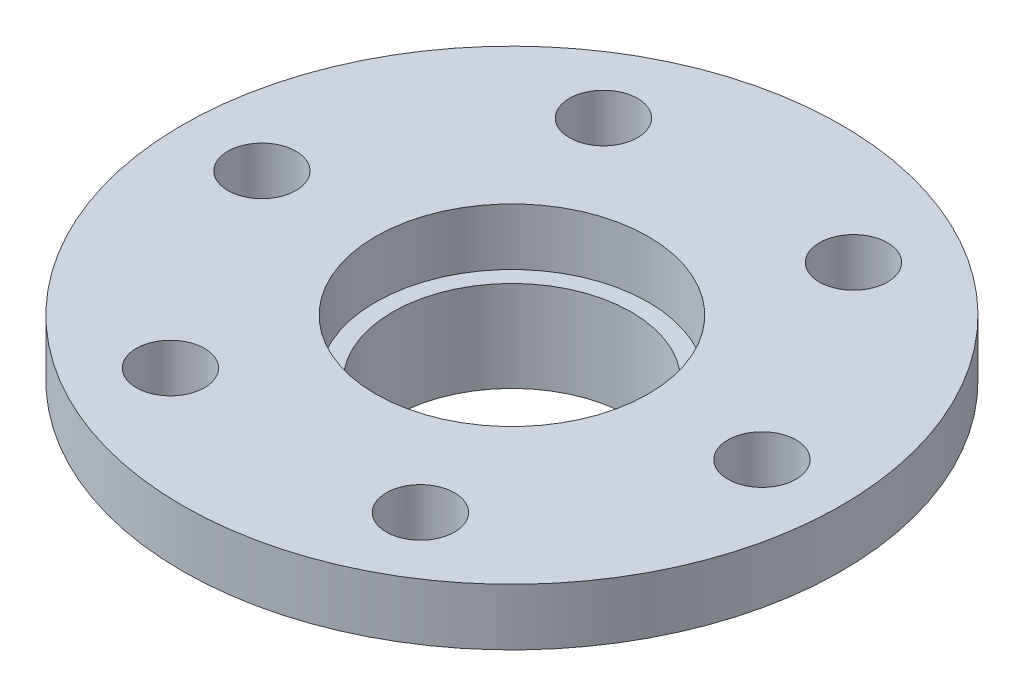
ISO-10303-21;
HEADER;
FILE_DESCRIPTION(('STEP AP214'),'2;1');
FILE_NAME('part.step','',(''),(''),'','','');
FILE_SCHEMA(('AUTOMOTIVE_DESIGN { 1 0 10303 214 1 1 1 1 }'));
ENDSEC;
DATA;
#1=APPLICATION_CONTEXT('core data for automotive mechanical design processes');
#2=APPLICATION_PROTOCOL_DEFINITION('international standard','automotive_design',2000,#1);
#3=PRODUCT_CONTEXT('',#1,'mechanical');
#4=PRODUCT('Part','Part','',(#3));
#5=PRODUCT_RELATED_PRODUCT_CATEGORY('part','',(#4));
#6=PRODUCT_DEFINITION_FORMATION('','',#4);
#7=PRODUCT_DEFINITION_CONTEXT('part definition',#1,'design');
#8=PRODUCT_DEFINITION('design','',#6,#7);
#9=PRODUCT_DEFINITION_SHAPE('','',#8);
#10=(LENGTH_UNIT() NAMED_UNIT(*) SI_UNIT(.MILLI.,.METRE.));
#11=(NAMED_UNIT(*) PLANE_ANGLE_UNIT() SI_UNIT($,.RADIAN.));
#12=(NAMED_UNIT(*) SI_UNIT($,.STERADIAN.) SOLID_ANGLE_UNIT());
#13=UNCERTAINTY_MEASURE_WITH_UNIT(LENGTH_MEASURE(1.E-05),#10,'distance_accuracy_value','');
#14=(GEOMETRIC_REPRESENTATION_CONTEXT(3) GLOBAL_UNCERTAINTY_ASSIGNED_CONTEXT((#13)) GLOBAL_UNIT_ASSIGNED_CONTEXT((#10,
#11,#12)) REPRESENTATION_CONTEXT('',''));
#15=CARTESIAN_POINT('',(0.,0.,0.));
#16=DIRECTION('',(0.,0.,1.));
#17=DIRECTION('',(1.,0.,0.));
#18=AXIS2_PLACEMENT_3D('',#15,#16,#17);
#19=CARTESIAN_POINT('',(0.,8.,0.));
#20=DIRECTION('',(0.,1.,0.));
#21=DIRECTION('',(0.,0.,1.));
#22=AXIS2_PLACEMENT_3D('',#19,#20,#21);
#23=PLANE('',#22);
#24=CARTESIAN_POINT('',(0.,8.,0.));
#25=DIRECTION('',(0.,1.,0.));
#26=DIRECTION('',(0.,0.,1.));
#27=AXIS2_PLACEMENT_3D('',#24,#25,#26);
#28=CIRCLE('',#27,29.);
#29=CARTESIAN_POINT('',(0.,8.,29.));
#30=VERTEX_POINT('',#29);
#31=EDGE_CURVE('E47',#30,#30,#28,.T.);
#32=ORIENTED_EDGE('',*,*,#31,.F.);
#33=EDGE_LOOP('',(#32));
#34=FACE_BOUND('',#33,.T.);
#35=CARTESIAN_POINT('',(11.,8.,-19.0525588832576));
#36=DIRECTION('',(0.,-1.,0.));
#37=DIRECTION('',(0.,0.,-1.));
#38=AXIS2_PLACEMENT_3D('',#35,#36,#37);
#39=CIRCLE('',#38,3.);
#40=CARTESIAN_POINT('',(11.,8.,-22.0525588832576));
#41=VERTEX_POINT('',#40);
#42=EDGE_CURVE('E87',#41,#41,#39,.T.);
#43=ORIENTED_EDGE('',*,*,#42,.F.);
#44=EDGE_LOOP('',(#43));
#45=FACE_BOUND('',#44,.T.);
#46=CARTESIAN_POINT('',(-11.,8.,-19.0525588832577));
#47=DIRECTION('',(0.,-1.,0.));
#48=DIRECTION('',(0.,0.,-1.));
#49=AXIS2_PLACEMENT_3D('',#46,#47,#48);
#50=CIRCLE('',#49,3.);
#51=CARTESIAN_POINT('',(-11.,8.,-22.0525588832577));
#52=VERTEX_POINT('',#51);
#53=EDGE_CURVE('E81',#52,#52,#50,.T.);
#54=ORIENTED_EDGE('',*,*,#53,.F.);
#55=EDGE_LOOP('',(#54));
#56=FACE_BOUND('',#55,.T.);
#57=CARTESIAN_POINT('',(-22.,8.,0.));
#58=DIRECTION('',(0.,-1.,0.));
#59=DIRECTION('',(0.,0.,-1.));
#60=AXIS2_PLACEMENT_3D('',#57,#58,#59);
#61=CIRCLE('',#60,3.);
#62=CARTESIAN_POINT('',(-22.,8.,-3.));
#63=VERTEX_POINT('',#62);
#64=EDGE_CURVE('E75',#63,#63,#61,.T.);
#65=ORIENTED_EDGE('',*,*,#64,.F.);
#66=EDGE_LOOP('',(#65));
#67=FACE_BOUND('',#66,.T.);
#68=CARTESIAN_POINT('',(-11.,8.,19.0525588832576));
#69=DIRECTION('',(0.,-1.,0.));
#70=DIRECTION('',(0.,0.,-1.));
#71=AXIS2_PLACEMENT_3D('',#68,#69,#70);
#72=CIRCLE('',#71,3.);
#73=CARTESIAN_POINT('',(-11.,8.,16.0525588832576));
#74=VERTEX_POINT('',#73);
#75=EDGE_CURVE('E68',#74,#74,#72,.T.);
#76=ORIENTED_EDGE('',*,*,#75,.F.);
#77=EDGE_LOOP('',(#76));
#78=FACE_BOUND('',#77,.T.);
#79=CARTESIAN_POINT('',(11.,8.,19.0525588832577));
#80=DIRECTION('',(0.,-1.,0.));
#81=DIRECTION('',(0.,0.,-1.));
#82=AXIS2_PLACEMENT_3D('',#79,#80,#81);
#83=CIRCLE('',#82,3.);
#84=CARTESIAN_POINT('',(11.,8.,16.0525588832577));
#85=VERTEX_POINT('',#84);
#86=EDGE_CURVE('E69',#85,#85,#83,.T.);
#87=ORIENTED_EDGE('',*,*,#86,.F.);
#88=EDGE_LOOP('',(#87));
#89=FACE_BOUND('',#88,.T.);
#90=CARTESIAN_POINT('',(22.,8.,0.));
#91=DIRECTION('',(0.,-1.,0.));
#92=DIRECTION('',(0.,0.,-1.));
#93=AXIS2_PLACEMENT_3D('',#90,#91,#92);
#94=CIRCLE('',#93,2.99999999999999);
#95=CARTESIAN_POINT('',(22.,8.,-2.99999999999999));
#96=VERTEX_POINT('',#95);
#97=EDGE_CURVE('E62',#96,#96,#94,.T.);
#98=ORIENTED_EDGE('',*,*,#97,.F.);
#99=EDGE_LOOP('',(#98));
#100=FACE_BOUND('',#99,.T.);
#101=CARTESIAN_POINT('',(0.,8.,0.));
#102=DIRECTION('',(0.,1.,0.));
#103=DIRECTION('',(0.,0.,1.));
#104=AXIS2_PLACEMENT_3D('',#101,#102,#103);
#105=CIRCLE('',#104,18.8);
#106=CARTESIAN_POINT('',(0.,8.,18.8));
#107=VERTEX_POINT('',#106);
#108=EDGE_CURVE('E10',#107,#107,#105,.F.);
#109=ORIENTED_EDGE('',*,*,#108,.F.);
#110=EDGE_LOOP('',(#109));
#111=FACE_BOUND('',#110,.T.);
#112=ADVANCED_FACE('F32',(#34,#45,#56,#67,#78,#89,#100,#111),#23,.F.);
#113=CARTESIAN_POINT('',(0.,8.,0.));
#114=DIRECTION('',(0.,-1.,0.));
#115=DIRECTION('',(0.,0.,-1.));
#116=AXIS2_PLACEMENT_3D('',#113,#114,#115);
#117=CYLINDRICAL_SURFACE('',#116,17.5);
#118=CARTESIAN_POINT('',(0.,7.,0.));
#119=DIRECTION('',(0.,-1.,0.));
#120=DIRECTION('',(0.,0.,-1.));
#121=AXIS2_PLACEMENT_3D('',#118,#119,#120);
#122=CIRCLE('',#121,17.5);
#123=CARTESIAN_POINT('',(0.,7.,-17.5));
#124=VERTEX_POINT('',#123);
#125=EDGE_CURVE('E103',#124,#124,#122,.T.);
#126=ORIENTED_EDGE('',*,*,#125,.T.);
#127=EDGE_LOOP('',(#126));
#128=FACE_BOUND('',#127,.T.);
#129=CARTESIAN_POINT('',(0.,0.,0.));
#130=DIRECTION('',(0.,1.,0.));
#131=DIRECTION('',(0.,0.,1.));
#132=AXIS2_PLACEMENT_3D('',#129,#130,#131);
#133=CIRCLE('',#132,17.5);
#134=CARTESIAN_POINT('',(0.,0.,17.5));
#135=VERTEX_POINT('',#134);
#136=EDGE_CURVE('E39',#135,#135,#133,.T.);
#137=ORIENTED_EDGE('',*,*,#136,.T.);
#138=EDGE_LOOP('',(#137));
#139=FACE_BOUND('',#138,.T.);
#140=ADVANCED_FACE('F34',(#128,#139),#117,.T.);
#141=CARTESIAN_POINT('',(0.,0.,0.));
#142=DIRECTION('',(0.,1.,0.));
#143=DIRECTION('',(0.,0.,1.));
#144=AXIS2_PLACEMENT_3D('',#141,#142,#143);
#145=PLANE('',#144);
#146=CARTESIAN_POINT('',(0.,0.,0.));
#147=DIRECTION('',(0.,1.,0.));
#148=DIRECTION('',(0.,0.,1.));
#149=AXIS2_PLACEMENT_3D('',#146,#147,#148);
#150=CIRCLE('',#149,10.5);
#151=CARTESIAN_POINT('',(0.,0.,10.5));
#152=VERTEX_POINT('',#151);
#153=EDGE_CURVE('E56',#152,#152,#150,.T.);
#154=ORIENTED_EDGE('',*,*,#153,.T.);
#155=EDGE_LOOP('',(#154));
#156=FACE_BOUND('',#155,.T.);
#157=ORIENTED_EDGE('',*,*,#136,.F.);
#158=EDGE_LOOP('',(#157));
#159=FACE_BOUND('',#158,.T.);
#160=ADVANCED_FACE('F129',(#156,#159),#145,.F.);
#161=CARTESIAN_POINT('',(0.,13.,0.));
#162=DIRECTION('',(0.,-1.,0.));
#163=DIRECTION('',(0.,0.,-1.));
#164=AXIS2_PLACEMENT_3D('',#161,#162,#163);
#165=CYLINDRICAL_SURFACE('',#164,29.);
#166=CARTESIAN_POINT('',(0.,13.,0.));
#167=DIRECTION('',(0.,1.,0.));
#168=DIRECTION('',(0.,0.,1.));
#169=AXIS2_PLACEMENT_3D('',#166,#167,#168);
#170=CIRCLE('',#169,29.);
#171=CARTESIAN_POINT('',(0.,13.,29.));
#172=VERTEX_POINT('',#171);
#173=EDGE_CURVE('E43',#172,#172,#170,.T.);
#174=ORIENTED_EDGE('',*,*,#173,.F.);
#175=EDGE_LOOP('',(#174));
#176=FACE_BOUND('',#175,.T.);
#177=ORIENTED_EDGE('',*,*,#31,.T.);
#178=EDGE_LOOP('',(#177));
#179=FACE_BOUND('',#178,.T.);
#180=ADVANCED_FACE('F136',(#176,#179),#165,.T.);
#181=CARTESIAN_POINT('',(0.,13.,0.));
#182=DIRECTION('',(0.,1.,0.));
#183=DIRECTION('',(0.,0.,1.));
#184=AXIS2_PLACEMENT_3D('',#181,#182,#183);
#185=PLANE('',#184);
#186=CARTESIAN_POINT('',(22.,13.,0.));
#187=DIRECTION('',(0.,1.,0.));
#188=DIRECTION('',(0.,0.,1.));
#189=AXIS2_PLACEMENT_3D('',#186,#187,#188);
#190=CIRCLE('',#189,2.99999999999999);
#191=CARTESIAN_POINT('',(22.,13.,2.99999999999999));
#192=VERTEX_POINT('',#191);
#193=EDGE_CURVE('E90',#192,#192,#190,.F.);
#194=ORIENTED_EDGE('',*,*,#193,.T.);
#195=EDGE_LOOP('',(#194));
#196=FACE_BOUND('',#195,.T.);
#197=CARTESIAN_POINT('',(11.,13.,19.0525588832577));
#198=DIRECTION('',(0.,1.,0.));
#199=DIRECTION('',(0.,0.,1.));
#200=AXIS2_PLACEMENT_3D('',#197,#198,#199);
#201=CIRCLE('',#200,3.);
#202=CARTESIAN_POINT('',(11.,13.,22.0525588832576));
#203=VERTEX_POINT('',#202);
#204=EDGE_CURVE('E91',#203,#203,#201,.F.);
#205=ORIENTED_EDGE('',*,*,#204,.T.);
#206=EDGE_LOOP('',(#205));
#207=FACE_BOUND('',#206,.T.);
#208=CARTESIAN_POINT('',(-11.,13.,19.0525588832576));
#209=DIRECTION('',(0.,1.,0.));
#210=DIRECTION('',(0.,0.,1.));
#211=AXIS2_PLACEMENT_3D('',#208,#209,#210);
#212=CIRCLE('',#211,3.);
#213=CARTESIAN_POINT('',(-11.,13.,22.0525588832576));
#214=VERTEX_POINT('',#213);
#215=EDGE_CURVE('E65',#214,#214,#212,.F.);
#216=ORIENTED_EDGE('',*,*,#215,.T.);
#217=EDGE_LOOP('',(#216));
#218=FACE_BOUND('',#217,.T.);
#219=CARTESIAN_POINT('',(-22.,13.,0.));
#220=DIRECTION('',(0.,1.,0.));
#221=DIRECTION('',(0.,0.,1.));
#222=AXIS2_PLACEMENT_3D('',#219,#220,#221);
#223=CIRCLE('',#222,3.);
#224=CARTESIAN_POINT('',(-22.,13.,3.));
#225=VERTEX_POINT('',#224);
#226=EDGE_CURVE('E72',#225,#225,#223,.F.);
#227=ORIENTED_EDGE('',*,*,#226,.T.);
#228=EDGE_LOOP('',(#227));
#229=FACE_BOUND('',#228,.T.);
#230=CARTESIAN_POINT('',(-11.,13.,-19.0525588832577));
#231=DIRECTION('',(0.,1.,0.));
#232=DIRECTION('',(0.,0.,1.));
#233=AXIS2_PLACEMENT_3D('',#230,#231,#232);
#234=CIRCLE('',#233,3.);
#235=CARTESIAN_POINT('',(-11.,13.,-16.0525588832577));
#236=VERTEX_POINT('',#235);
#237=EDGE_CURVE('E78',#236,#236,#234,.F.);
#238=ORIENTED_EDGE('',*,*,#237,.T.);
#239=EDGE_LOOP('',(#238));
#240=FACE_BOUND('',#239,.T.);
#241=CARTESIAN_POINT('',(11.,13.,-19.0525588832576));
#242=DIRECTION('',(0.,1.,0.));
#243=DIRECTION('',(0.,0.,1.));
#244=AXIS2_PLACEMENT_3D('',#241,#242,#243);
#245=CIRCLE('',#244,3.);
#246=CARTESIAN_POINT('',(11.,13.,-16.0525588832576));
#247=VERTEX_POINT('',#246);
#248=EDGE_CURVE('E84',#247,#247,#245,.F.);
#249=ORIENTED_EDGE('',*,*,#248,.T.);
#250=EDGE_LOOP('',(#249));
#251=FACE_BOUND('',#250,.T.);
#252=CARTESIAN_POINT('',(0.,13.,0.));
#253=DIRECTION('',(0.,1.,0.));
#254=DIRECTION('',(0.,0.,1.));
#255=AXIS2_PLACEMENT_3D('',#252,#253,#254);
#256=CIRCLE('',#255,12.);
#257=CARTESIAN_POINT('',(0.,13.,12.));
#258=VERTEX_POINT('',#257);
#259=EDGE_CURVE('E53',#258,#258,#256,.T.);
#260=ORIENTED_EDGE('',*,*,#259,.F.);
#261=EDGE_LOOP('',(#260));
#262=FACE_BOUND('',#261,.T.);
#263=ORIENTED_EDGE('',*,*,#173,.T.);
#264=EDGE_LOOP('',(#263));
#265=FACE_BOUND('',#264,.T.);
#266=ADVANCED_FACE('F134',(#196,#207,#218,#229,#240,#251,#262,#265),#185,.T.);
#267=CARTESIAN_POINT('',(0.,8.,0.));
#268=DIRECTION('',(0.,1.,0.));
#269=DIRECTION('',(0.,0.,1.));
#270=AXIS2_PLACEMENT_3D('',#267,#268,#269);
#271=CYLINDRICAL_SURFACE('',#270,12.);
#272=CARTESIAN_POINT('',(0.,8.,0.));
#273=DIRECTION('',(0.,1.,0.));
#274=DIRECTION('',(0.,0.,1.));
#275=AXIS2_PLACEMENT_3D('',#272,#273,#274);
#276=CIRCLE('',#275,12.);
#277=CARTESIAN_POINT('',(0.,8.,12.));
#278=VERTEX_POINT('',#277);
#279=EDGE_CURVE('E51',#278,#278,#276,.T.);
#280=ORIENTED_EDGE('',*,*,#279,.F.);
#281=EDGE_LOOP('',(#280));
#282=FACE_BOUND('',#281,.T.);
#283=ORIENTED_EDGE('',*,*,#259,.T.);
#284=EDGE_LOOP('',(#283));
#285=FACE_BOUND('',#284,.T.);
#286=ADVANCED_FACE('F156',(#282,#285),#271,.F.);
#287=CARTESIAN_POINT('',(0.,8.,0.));
#288=DIRECTION('',(0.,1.,0.));
#289=DIRECTION('',(0.,0.,1.));
#290=AXIS2_PLACEMENT_3D('',#287,#288,#289);
#291=PLANE('',#290);
#292=CARTESIAN_POINT('',(0.,8.,0.));
#293=DIRECTION('',(0.,1.,0.));
#294=DIRECTION('',(0.,0.,1.));
#295=AXIS2_PLACEMENT_3D('',#292,#293,#294);
#296=CIRCLE('',#295,10.5);
#297=CARTESIAN_POINT('',(0.,8.,10.5));
#298=VERTEX_POINT('',#297);
#299=EDGE_CURVE('E59',#298,#298,#296,.T.);
#300=ORIENTED_EDGE('',*,*,#299,.F.);
#301=EDGE_LOOP('',(#300));
#302=FACE_BOUND('',#301,.T.);
#303=ORIENTED_EDGE('',*,*,#279,.T.);
#304=EDGE_LOOP('',(#303));
#305=FACE_BOUND('',#304,.T.);
#306=ADVANCED_FACE('F150',(#302,#305),#291,.T.);
#307=CARTESIAN_POINT('',(0.,0.,0.));
#308=DIRECTION('',(0.,1.,0.));
#309=DIRECTION('',(0.,0.,1.));
#310=AXIS2_PLACEMENT_3D('',#307,#308,#309);
#311=CYLINDRICAL_SURFACE('',#310,10.5);
#312=ORIENTED_EDGE('',*,*,#153,.F.);
#313=EDGE_LOOP('',(#312));
#314=FACE_BOUND('',#313,.T.);
#315=ORIENTED_EDGE('',*,*,#299,.T.);
#316=EDGE_LOOP('',(#315));
#317=FACE_BOUND('',#316,.T.);
#318=ADVANCED_FACE('F146',(#314,#317),#311,.F.);
#319=CARTESIAN_POINT('',(11.,13.001,-19.0525588832576));
#320=DIRECTION('',(0.,-1.,0.));
#321=DIRECTION('',(0.,0.,-1.));
#322=AXIS2_PLACEMENT_3D('',#319,#320,#321);
#323=CYLINDRICAL_SURFACE('',#322,3.);
#324=ORIENTED_EDGE('',*,*,#248,.F.);
#325=EDGE_LOOP('',(#324));
#326=FACE_BOUND('',#325,.T.);
#327=ORIENTED_EDGE('',*,*,#42,.T.);
#328=EDGE_LOOP('',(#327));
#329=FACE_BOUND('',#328,.T.);
#330=ADVANCED_FACE('F149',(#326,#329),#323,.F.);
#331=CARTESIAN_POINT('',(-11.,13.001,-19.0525588832577));
#332=DIRECTION('',(0.,-1.,0.));
#333=DIRECTION('',(0.,0.,-1.));
#334=AXIS2_PLACEMENT_3D('',#331,#332,#333);
#335=CYLINDRICAL_SURFACE('',#334,3.);
#336=ORIENTED_EDGE('',*,*,#237,.F.);
#337=EDGE_LOOP('',(#336));
#338=FACE_BOUND('',#337,.T.);
#339=ORIENTED_EDGE('',*,*,#53,.T.);
#340=EDGE_LOOP('',(#339));
#341=FACE_BOUND('',#340,.T.);
#342=ADVANCED_FACE('F185',(#338,#341),#335,.F.);
#343=CARTESIAN_POINT('',(-22.,13.001,0.));
#344=DIRECTION('',(0.,-1.,0.));
#345=DIRECTION('',(0.,0.,-1.));
#346=AXIS2_PLACEMENT_3D('',#343,#344,#345);
#347=CYLINDRICAL_SURFACE('',#346,3.);
#348=ORIENTED_EDGE('',*,*,#226,.F.);
#349=EDGE_LOOP('',(#348));
#350=FACE_BOUND('',#349,.T.);
#351=ORIENTED_EDGE('',*,*,#64,.T.);
#352=EDGE_LOOP('',(#351));
#353=FACE_BOUND('',#352,.T.);
#354=ADVANCED_FACE('F208',(#350,#353),#347,.F.);
#355=CARTESIAN_POINT('',(-11.,13.001,19.0525588832576));
#356=DIRECTION('',(0.,-1.,0.));
#357=DIRECTION('',(0.,0.,-1.));
#358=AXIS2_PLACEMENT_3D('',#355,#356,#357);
#359=CYLINDRICAL_SURFACE('',#358,3.);
#360=ORIENTED_EDGE('',*,*,#215,.F.);
#361=EDGE_LOOP('',(#360));
#362=FACE_BOUND('',#361,.T.);
#363=ORIENTED_EDGE('',*,*,#75,.T.);
#364=EDGE_LOOP('',(#363));
#365=FACE_BOUND('',#364,.T.);
#366=ADVANCED_FACE('F202',(#362,#365),#359,.F.);
#367=CARTESIAN_POINT('',(11.,13.001,19.0525588832577));
#368=DIRECTION('',(0.,-1.,0.));
#369=DIRECTION('',(0.,0.,-1.));
#370=AXIS2_PLACEMENT_3D('',#367,#368,#369);
#371=CYLINDRICAL_SURFACE('',#370,3.);
#372=ORIENTED_EDGE('',*,*,#204,.F.);
#373=EDGE_LOOP('',(#372));
#374=FACE_BOUND('',#373,.T.);
#375=ORIENTED_EDGE('',*,*,#86,.T.);
#376=EDGE_LOOP('',(#375));
#377=FACE_BOUND('',#376,.T.);
#378=ADVANCED_FACE('F120',(#374,#377),#371,.F.);
#379=CARTESIAN_POINT('',(22.,13.001,0.));
#380=DIRECTION('',(0.,-1.,0.));
#381=DIRECTION('',(0.,0.,-1.));
#382=AXIS2_PLACEMENT_3D('',#379,#380,#381);
#383=CYLINDRICAL_SURFACE('',#382,2.99999999999999);
#384=ORIENTED_EDGE('',*,*,#193,.F.);
#385=EDGE_LOOP('',(#384));
#386=FACE_BOUND('',#385,.T.);
#387=ORIENTED_EDGE('',*,*,#97,.T.);
#388=EDGE_LOOP('',(#387));
#389=FACE_BOUND('',#388,.T.);
#390=ADVANCED_FACE('F111',(#386,#389),#383,.F.);
#391=CARTESIAN_POINT('',(0.,7.,0.));
#392=DIRECTION('',(0.,-1.,0.));
#393=DIRECTION('',(0.,0.,-1.));
#394=AXIS2_PLACEMENT_3D('',#391,#392,#393);
#395=PLANE('',#394);
#396=CARTESIAN_POINT('',(0.,7.,0.));
#397=DIRECTION('',(0.,-1.,0.));
#398=DIRECTION('',(0.,0.,-1.));
#399=AXIS2_PLACEMENT_3D('',#396,#397,#398);
#400=CIRCLE('',#399,18.8);
#401=CARTESIAN_POINT('',(0.,7.,-18.8));
#402=VERTEX_POINT('',#401);
#403=EDGE_CURVE('E94',#402,#402,#400,.T.);
#404=ORIENTED_EDGE('',*,*,#403,.T.);
#405=EDGE_LOOP('',(#404));
#406=FACE_BOUND('',#405,.T.);
#407=ORIENTED_EDGE('',*,*,#125,.F.);
#408=EDGE_LOOP('',(#407));
#409=FACE_BOUND('',#408,.T.);
#410=ADVANCED_FACE('F108',(#406,#409),#395,.T.);
#411=CARTESIAN_POINT('',(0.,7.,0.));
#412=DIRECTION('',(0.,1.,0.));
#413=DIRECTION('',(0.,0.,1.));
#414=AXIS2_PLACEMENT_3D('',#411,#412,#413);
#415=CYLINDRICAL_SURFACE('',#414,18.8);
#416=ORIENTED_EDGE('',*,*,#403,.F.);
#417=EDGE_LOOP('',(#416));
#418=FACE_BOUND('',#417,.T.);
#419=ORIENTED_EDGE('',*,*,#108,.T.);
#420=EDGE_LOOP('',(#419));
#421=FACE_BOUND('',#420,.T.);
#422=ADVANCED_FACE('F110',(#418,#421),#415,.T.);
#423=CLOSED_SHELL('',(#112,#140,#160,#180,#266,#286,#306,#318,#330,#342,#354,#366,#378,#390,
#410,#422));
#424=MANIFOLD_SOLID_BREP('B2',#423);
#425=ADVANCED_BREP_SHAPE_REPRESENTATION('',(#18,#424),#14);
#426=SHAPE_DEFINITION_REPRESENTATION(#9,#425);
ENDSEC;
END-ISO-10303-21;
